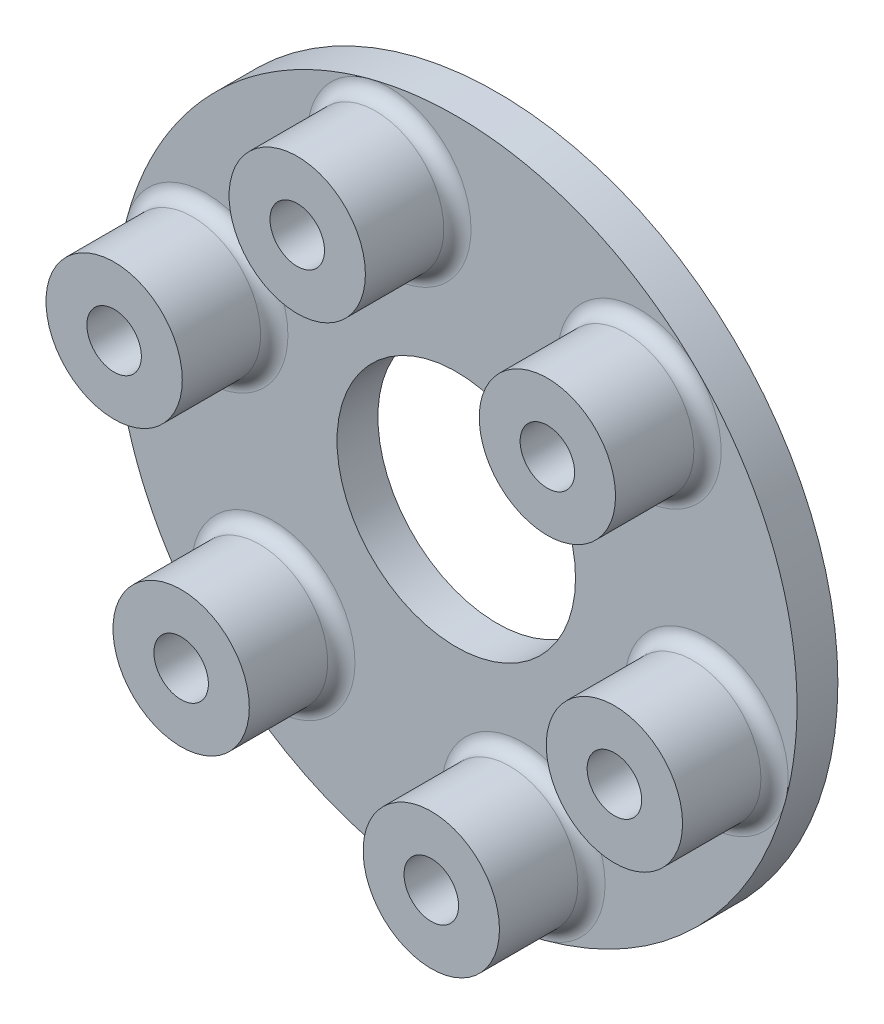
ISO-10303-21;
HEADER;
FILE_DESCRIPTION(('STEP AP214'),'2;1');
FILE_NAME('part.step','',(''),(''),'','','');
FILE_SCHEMA(('AUTOMOTIVE_DESIGN { 1 0 10303 214 1 1 1 1 }'));
ENDSEC;
DATA;
#1=APPLICATION_CONTEXT('core data for automotive mechanical design processes');
#2=APPLICATION_PROTOCOL_DEFINITION('international standard','automotive_design',2000,#1);
#3=PRODUCT_CONTEXT('',#1,'mechanical');
#4=PRODUCT('Part','Part','',(#3));
#5=PRODUCT_RELATED_PRODUCT_CATEGORY('part','',(#4));
#6=PRODUCT_DEFINITION_FORMATION('','',#4);
#7=PRODUCT_DEFINITION_CONTEXT('part definition',#1,'design');
#8=PRODUCT_DEFINITION('design','',#6,#7);
#9=PRODUCT_DEFINITION_SHAPE('','',#8);
#10=(LENGTH_UNIT() NAMED_UNIT(*) SI_UNIT(.MILLI.,.METRE.));
#11=(NAMED_UNIT(*) PLANE_ANGLE_UNIT() SI_UNIT($,.RADIAN.));
#12=(NAMED_UNIT(*) SI_UNIT($,.STERADIAN.) SOLID_ANGLE_UNIT());
#13=UNCERTAINTY_MEASURE_WITH_UNIT(LENGTH_MEASURE(1.E-05),#10,'distance_accuracy_value','');
#14=(GEOMETRIC_REPRESENTATION_CONTEXT(3) GLOBAL_UNCERTAINTY_ASSIGNED_CONTEXT((#13)) GLOBAL_UNIT_ASSIGNED_CONTEXT((#10,
#11,#12)) REPRESENTATION_CONTEXT('',''));
#15=CARTESIAN_POINT('',(0.,0.,0.));
#16=DIRECTION('',(0.,0.,1.));
#17=DIRECTION('',(1.,0.,0.));
#18=AXIS2_PLACEMENT_3D('',#15,#16,#17);
#19=CARTESIAN_POINT('',(4.91756185694798,-18.3525906994923,4.));
#20=DIRECTION('',(0.,0.,1.));
#21=DIRECTION('',(1.,0.,0.));
#22=AXIS2_PLACEMENT_3D('',#19,#20,#21);
#23=TOROIDAL_SURFACE('',#22,6.,1.);
#24=CARTESIAN_POINT('',(4.91756185694798,-18.3525906994923,4.));
#25=DIRECTION('',(0.,0.,1.));
#26=DIRECTION('',(1.,0.,0.));
#27=AXIS2_PLACEMENT_3D('',#24,#25,#26);
#28=CIRCLE('',#27,5.);
#29=CARTESIAN_POINT('',(9.91756185694798,-18.3525906994923,4.));
#30=VERTEX_POINT('',#29);
#31=EDGE_CURVE('E39',#30,#30,#28,.T.);
#32=ORIENTED_EDGE('',*,*,#31,.F.);
#33=EDGE_LOOP('',(#32));
#34=FACE_BOUND('',#33,.T.);
#35=CARTESIAN_POINT('',(4.91756185694798,-18.3525906994923,3.));
#36=DIRECTION('',(0.,0.,1.));
#37=DIRECTION('',(1.,0.,0.));
#38=AXIS2_PLACEMENT_3D('',#35,#36,#37);
#39=CIRCLE('',#38,6.);
#40=CARTESIAN_POINT('',(6.47047612756313,-24.1481456572267,3.));
#41=VERTEX_POINT('',#40);
#42=EDGE_CURVE('E11',#41,#41,#39,.F.);
#43=ORIENTED_EDGE('',*,*,#42,.F.);
#44=EDGE_LOOP('',(#43));
#45=FACE_BOUND('',#44,.T.);
#46=ADVANCED_FACE('F32',(#34,#45),#23,.F.);
#47=CARTESIAN_POINT('',(18.3525906994923,-4.91756185694791,4.));
#48=DIRECTION('',(0.,0.,1.));
#49=DIRECTION('',(1.,0.,0.));
#50=AXIS2_PLACEMENT_3D('',#47,#48,#49);
#51=TOROIDAL_SURFACE('',#50,6.,1.);
#52=CARTESIAN_POINT('',(18.3525906994923,-4.91756185694791,4.));
#53=DIRECTION('',(0.,0.,1.));
#54=DIRECTION('',(1.,0.,0.));
#55=AXIS2_PLACEMENT_3D('',#52,#53,#54);
#56=CIRCLE('',#55,5.);
#57=CARTESIAN_POINT('',(23.3525906994923,-4.91756185694791,4.));
#58=VERTEX_POINT('',#57);
#59=EDGE_CURVE('E173',#58,#58,#56,.T.);
#60=ORIENTED_EDGE('',*,*,#59,.F.);
#61=EDGE_LOOP('',(#60));
#62=FACE_BOUND('',#61,.T.);
#63=CARTESIAN_POINT('',(18.3525906994923,-4.91756185694791,3.));
#64=DIRECTION('',(0.,0.,1.));
#65=DIRECTION('',(1.,0.,0.));
#66=AXIS2_PLACEMENT_3D('',#63,#64,#65);
#67=CIRCLE('',#66,6.);
#68=CARTESIAN_POINT('',(24.1481456572267,-6.47047612756304,3.));
#69=VERTEX_POINT('',#68);
#70=EDGE_CURVE('E176',#69,#69,#67,.F.);
#71=ORIENTED_EDGE('',*,*,#70,.F.);
#72=EDGE_LOOP('',(#71));
#73=FACE_BOUND('',#72,.T.);
#74=ADVANCED_FACE('F185',(#62,#73),#51,.F.);
#75=CARTESIAN_POINT('',(13.4350288425444,13.4350288425444,4.));
#76=DIRECTION('',(0.,0.,1.));
#77=DIRECTION('',(1.,0.,0.));
#78=AXIS2_PLACEMENT_3D('',#75,#76,#77);
#79=TOROIDAL_SURFACE('',#78,6.,1.);
#80=CARTESIAN_POINT('',(13.4350288425444,13.4350288425444,4.));
#81=DIRECTION('',(0.,0.,1.));
#82=DIRECTION('',(1.,0.,0.));
#83=AXIS2_PLACEMENT_3D('',#80,#81,#82);
#84=CIRCLE('',#83,5.);
#85=CARTESIAN_POINT('',(18.4350288425444,13.4350288425444,4.));
#86=VERTEX_POINT('',#85);
#87=EDGE_CURVE('E169',#86,#86,#84,.T.);
#88=ORIENTED_EDGE('',*,*,#87,.F.);
#89=EDGE_LOOP('',(#88));
#90=FACE_BOUND('',#89,.T.);
#91=CARTESIAN_POINT('',(13.4350288425444,13.4350288425444,3.));
#92=DIRECTION('',(0.,0.,1.));
#93=DIRECTION('',(1.,0.,0.));
#94=AXIS2_PLACEMENT_3D('',#91,#92,#93);
#95=CIRCLE('',#94,6.);
#96=CARTESIAN_POINT('',(17.6776695296637,17.6776695296637,3.));
#97=VERTEX_POINT('',#96);
#98=EDGE_CURVE('E93',#97,#97,#95,.F.);
#99=ORIENTED_EDGE('',*,*,#98,.F.);
#100=EDGE_LOOP('',(#99));
#101=FACE_BOUND('',#100,.T.);
#102=ADVANCED_FACE('F189',(#90,#101),#79,.F.);
#103=CARTESIAN_POINT('',(-4.91756185694797,18.3525906994923,4.));
#104=DIRECTION('',(0.,0.,1.));
#105=DIRECTION('',(1.,0.,0.));
#106=AXIS2_PLACEMENT_3D('',#103,#104,#105);
#107=TOROIDAL_SURFACE('',#106,6.,1.);
#108=CARTESIAN_POINT('',(-4.91756185694797,18.3525906994923,4.));
#109=DIRECTION('',(0.,0.,1.));
#110=DIRECTION('',(1.,0.,0.));
#111=AXIS2_PLACEMENT_3D('',#108,#109,#110);
#112=CIRCLE('',#111,5.);
#113=CARTESIAN_POINT('',(0.0824381430520266,18.3525906994923,4.));
#114=VERTEX_POINT('',#113);
#115=EDGE_CURVE('E165',#114,#114,#112,.T.);
#116=ORIENTED_EDGE('',*,*,#115,.F.);
#117=EDGE_LOOP('',(#116));
#118=FACE_BOUND('',#117,.T.);
#119=CARTESIAN_POINT('',(-4.91756185694797,18.3525906994923,3.));
#120=DIRECTION('',(0.,0.,1.));
#121=DIRECTION('',(1.,0.,0.));
#122=AXIS2_PLACEMENT_3D('',#119,#120,#121);
#123=CIRCLE('',#122,6.);
#124=CARTESIAN_POINT('',(-6.47047612756313,24.1481456572267,3.));
#125=VERTEX_POINT('',#124);
#126=EDGE_CURVE('E91',#125,#125,#123,.F.);
#127=ORIENTED_EDGE('',*,*,#126,.F.);
#128=EDGE_LOOP('',(#127));
#129=FACE_BOUND('',#128,.T.);
#130=ADVANCED_FACE('F194',(#118,#129),#107,.F.);
#131=CARTESIAN_POINT('',(-18.3525906994923,4.91756185694781,4.));
#132=DIRECTION('',(0.,0.,1.));
#133=DIRECTION('',(1.,0.,0.));
#134=AXIS2_PLACEMENT_3D('',#131,#132,#133);
#135=TOROIDAL_SURFACE('',#134,6.,1.);
#136=CARTESIAN_POINT('',(-18.3525906994923,4.91756185694781,4.));
#137=DIRECTION('',(0.,0.,1.));
#138=DIRECTION('',(1.,0.,0.));
#139=AXIS2_PLACEMENT_3D('',#136,#137,#138);
#140=CIRCLE('',#139,5.);
#141=CARTESIAN_POINT('',(-13.3525906994923,4.91756185694781,4.));
#142=VERTEX_POINT('',#141);
#143=EDGE_CURVE('E161',#142,#142,#140,.T.);
#144=ORIENTED_EDGE('',*,*,#143,.F.);
#145=EDGE_LOOP('',(#144));
#146=FACE_BOUND('',#145,.T.);
#147=CARTESIAN_POINT('',(-18.3525906994923,4.91756185694781,3.));
#148=DIRECTION('',(0.,0.,1.));
#149=DIRECTION('',(1.,0.,0.));
#150=AXIS2_PLACEMENT_3D('',#147,#148,#149);
#151=CIRCLE('',#150,6.);
#152=CARTESIAN_POINT('',(-24.1481456572267,6.47047612756291,3.));
#153=VERTEX_POINT('',#152);
#154=EDGE_CURVE('E69',#153,#153,#151,.F.);
#155=ORIENTED_EDGE('',*,*,#154,.F.);
#156=EDGE_LOOP('',(#155));
#157=FACE_BOUND('',#156,.T.);
#158=ADVANCED_FACE('F202',(#146,#157),#135,.F.);
#159=CARTESIAN_POINT('',(-13.4350288425443,-13.4350288425445,4.));
#160=DIRECTION('',(0.,0.,1.));
#161=DIRECTION('',(1.,0.,0.));
#162=AXIS2_PLACEMENT_3D('',#159,#160,#161);
#163=TOROIDAL_SURFACE('',#162,6.,1.);
#164=CARTESIAN_POINT('',(-13.4350288425443,-13.4350288425445,4.));
#165=DIRECTION('',(0.,0.,1.));
#166=DIRECTION('',(1.,0.,0.));
#167=AXIS2_PLACEMENT_3D('',#164,#165,#166);
#168=CIRCLE('',#167,5.);
#169=CARTESIAN_POINT('',(-8.43502884254434,-13.4350288425445,4.));
#170=VERTEX_POINT('',#169);
#171=EDGE_CURVE('E82',#170,#170,#168,.T.);
#172=ORIENTED_EDGE('',*,*,#171,.F.);
#173=EDGE_LOOP('',(#172));
#174=FACE_BOUND('',#173,.T.);
#175=CARTESIAN_POINT('',(-13.4350288425443,-13.4350288425445,3.));
#176=DIRECTION('',(0.,0.,1.));
#177=DIRECTION('',(1.,0.,0.));
#178=AXIS2_PLACEMENT_3D('',#175,#176,#177);
#179=CIRCLE('',#178,6.);
#180=CARTESIAN_POINT('',(-17.6776695296636,-17.6776695296638,3.));
#181=VERTEX_POINT('',#180);
#182=EDGE_CURVE('E67',#181,#181,#179,.F.);
#183=ORIENTED_EDGE('',*,*,#182,.F.);
#184=EDGE_LOOP('',(#183));
#185=FACE_BOUND('',#184,.T.);
#186=ADVANCED_FACE('F206',(#174,#185),#163,.F.);
#187=CARTESIAN_POINT('',(0.,0.,3.));
#188=DIRECTION('',(0.,0.,1.));
#189=DIRECTION('',(1.,0.,0.));
#190=AXIS2_PLACEMENT_3D('',#187,#188,#189);
#191=PLANE('',#190);
#192=CARTESIAN_POINT('',(0.,0.,3.));
#193=DIRECTION('',(0.,0.,1.));
#194=DIRECTION('',(1.,0.,0.));
#195=AXIS2_PLACEMENT_3D('',#192,#193,#194);
#196=CIRCLE('',#195,25.);
#197=EDGE_CURVE('E76',#181,#41,#196,.T.);
#198=ORIENTED_EDGE('',*,*,#197,.T.);
#199=ORIENTED_EDGE('',*,*,#42,.T.);
#200=EDGE_CURVE('E48',#41,#69,#196,.T.);
#201=ORIENTED_EDGE('',*,*,#200,.T.);
#202=ORIENTED_EDGE('',*,*,#70,.T.);
#203=EDGE_CURVE('E85',#69,#97,#196,.T.);
#204=ORIENTED_EDGE('',*,*,#203,.T.);
#205=ORIENTED_EDGE('',*,*,#98,.T.);
#206=EDGE_CURVE('E77',#97,#125,#196,.T.);
#207=ORIENTED_EDGE('',*,*,#206,.T.);
#208=ORIENTED_EDGE('',*,*,#126,.T.);
#209=EDGE_CURVE('E73',#125,#153,#196,.T.);
#210=ORIENTED_EDGE('',*,*,#209,.T.);
#211=ORIENTED_EDGE('',*,*,#154,.T.);
#212=EDGE_CURVE('E63',#153,#181,#196,.T.);
#213=ORIENTED_EDGE('',*,*,#212,.T.);
#214=ORIENTED_EDGE('',*,*,#182,.T.);
#215=EDGE_LOOP('',(#198,#199,#201,#202,#204,#205,#207,#208,#210,#211,#213,#214));
#216=FACE_BOUND('',#215,.T.);
#217=CARTESIAN_POINT('',(0.,0.,3.));
#218=DIRECTION('',(0.,0.,1.));
#219=DIRECTION('',(1.,0.,0.));
#220=AXIS2_PLACEMENT_3D('',#217,#218,#219);
#221=CIRCLE('',#220,8.75);
#222=CARTESIAN_POINT('',(8.75,0.,3.));
#223=VERTEX_POINT('',#222);
#224=EDGE_CURVE('E79',#223,#223,#221,.T.);
#225=ORIENTED_EDGE('',*,*,#224,.F.);
#226=EDGE_LOOP('',(#225));
#227=FACE_BOUND('',#226,.T.);
#228=ADVANCED_FACE('F64',(#216,#227),#191,.T.);
#229=CARTESIAN_POINT('',(0.,0.,0.));
#230=DIRECTION('',(0.,0.,1.));
#231=DIRECTION('',(1.,0.,0.));
#232=AXIS2_PLACEMENT_3D('',#229,#230,#231);
#233=PLANE('',#232);
#234=CARTESIAN_POINT('',(-18.3525906994923,4.91756185694781,0.));
#235=DIRECTION('',(0.,0.,1.));
#236=DIRECTION('',(1.,0.,0.));
#237=AXIS2_PLACEMENT_3D('',#234,#235,#236);
#238=CIRCLE('',#237,2.);
#239=CARTESIAN_POINT('',(-16.3525906994923,4.91756185694781,0.));
#240=VERTEX_POINT('',#239);
#241=EDGE_CURVE('E148',#240,#240,#238,.T.);
#242=ORIENTED_EDGE('',*,*,#241,.T.);
#243=EDGE_LOOP('',(#242));
#244=FACE_BOUND('',#243,.T.);
#245=CARTESIAN_POINT('',(-13.4350288425443,-13.4350288425445,0.));
#246=DIRECTION('',(0.,0.,1.));
#247=DIRECTION('',(1.,0.,0.));
#248=AXIS2_PLACEMENT_3D('',#245,#246,#247);
#249=CIRCLE('',#248,2.);
#250=CARTESIAN_POINT('',(-11.4350288425443,-13.4350288425445,0.));
#251=VERTEX_POINT('',#250);
#252=EDGE_CURVE('E152',#251,#251,#249,.T.);
#253=ORIENTED_EDGE('',*,*,#252,.T.);
#254=EDGE_LOOP('',(#253));
#255=FACE_BOUND('',#254,.T.);
#256=CARTESIAN_POINT('',(4.91756185694798,-18.3525906994923,0.));
#257=DIRECTION('',(0.,0.,1.));
#258=DIRECTION('',(1.,0.,0.));
#259=AXIS2_PLACEMENT_3D('',#256,#257,#258);
#260=CIRCLE('',#259,2.);
#261=CARTESIAN_POINT('',(6.91756185694798,-18.3525906994923,0.));
#262=VERTEX_POINT('',#261);
#263=EDGE_CURVE('E156',#262,#262,#260,.T.);
#264=ORIENTED_EDGE('',*,*,#263,.T.);
#265=EDGE_LOOP('',(#264));
#266=FACE_BOUND('',#265,.T.);
#267=CARTESIAN_POINT('',(18.3525906994923,-4.91756185694791,0.));
#268=DIRECTION('',(0.,0.,1.));
#269=DIRECTION('',(1.,0.,0.));
#270=AXIS2_PLACEMENT_3D('',#267,#268,#269);
#271=CIRCLE('',#270,2.);
#272=CARTESIAN_POINT('',(20.3525906994923,-4.91756185694791,0.));
#273=VERTEX_POINT('',#272);
#274=EDGE_CURVE('E291',#273,#273,#271,.T.);
#275=ORIENTED_EDGE('',*,*,#274,.T.);
#276=EDGE_LOOP('',(#275));
#277=FACE_BOUND('',#276,.T.);
#278=CARTESIAN_POINT('',(13.4350288425444,13.4350288425444,0.));
#279=DIRECTION('',(0.,0.,1.));
#280=DIRECTION('',(1.,0.,0.));
#281=AXIS2_PLACEMENT_3D('',#278,#279,#280);
#282=CIRCLE('',#281,2.);
#283=CARTESIAN_POINT('',(15.4350288425444,13.4350288425444,0.));
#284=VERTEX_POINT('',#283);
#285=EDGE_CURVE('E289',#284,#284,#282,.T.);
#286=ORIENTED_EDGE('',*,*,#285,.T.);
#287=EDGE_LOOP('',(#286));
#288=FACE_BOUND('',#287,.T.);
#289=CARTESIAN_POINT('',(-4.91756185694797,18.3525906994923,0.));
#290=DIRECTION('',(0.,0.,1.));
#291=DIRECTION('',(1.,0.,0.));
#292=AXIS2_PLACEMENT_3D('',#289,#290,#291);
#293=CIRCLE('',#292,2.);
#294=CARTESIAN_POINT('',(-2.91756185694797,18.3525906994923,0.));
#295=VERTEX_POINT('',#294);
#296=EDGE_CURVE('E292',#295,#295,#293,.T.);
#297=ORIENTED_EDGE('',*,*,#296,.T.);
#298=EDGE_LOOP('',(#297));
#299=FACE_BOUND('',#298,.T.);
#300=CARTESIAN_POINT('',(0.,0.,0.));
#301=DIRECTION('',(0.,0.,1.));
#302=DIRECTION('',(1.,0.,0.));
#303=AXIS2_PLACEMENT_3D('',#300,#301,#302);
#304=CIRCLE('',#303,25.);
#305=CARTESIAN_POINT('',(25.,0.,0.));
#306=VERTEX_POINT('',#305);
#307=EDGE_CURVE('E74',#306,#306,#304,.T.);
#308=ORIENTED_EDGE('',*,*,#307,.F.);
#309=EDGE_LOOP('',(#308));
#310=FACE_BOUND('',#309,.T.);
#311=CARTESIAN_POINT('',(0.,0.,0.));
#312=DIRECTION('',(0.,0.,1.));
#313=DIRECTION('',(1.,0.,0.));
#314=AXIS2_PLACEMENT_3D('',#311,#312,#313);
#315=CIRCLE('',#314,8.75);
#316=CARTESIAN_POINT('',(8.75,0.,0.));
#317=VERTEX_POINT('',#316);
#318=EDGE_CURVE('E108',#317,#317,#315,.T.);
#319=ORIENTED_EDGE('',*,*,#318,.T.);
#320=EDGE_LOOP('',(#319));
#321=FACE_BOUND('',#320,.T.);
#322=ADVANCED_FACE('F98',(#244,#255,#266,#277,#288,#299,#310,#321),#233,.F.);
#323=CARTESIAN_POINT('',(0.,0.,3.));
#324=DIRECTION('',(0.,0.,-1.));
#325=DIRECTION('',(-1.,0.,0.));
#326=AXIS2_PLACEMENT_3D('',#323,#324,#325);
#327=CYLINDRICAL_SURFACE('',#326,25.);
#328=ORIENTED_EDGE('',*,*,#197,.F.);
#329=ORIENTED_EDGE('',*,*,#212,.F.);
#330=ORIENTED_EDGE('',*,*,#209,.F.);
#331=ORIENTED_EDGE('',*,*,#206,.F.);
#332=ORIENTED_EDGE('',*,*,#203,.F.);
#333=ORIENTED_EDGE('',*,*,#200,.F.);
#334=EDGE_LOOP('',(#328,#329,#330,#331,#332,#333));
#335=FACE_BOUND('',#334,.T.);
#336=ORIENTED_EDGE('',*,*,#307,.T.);
#337=EDGE_LOOP('',(#336));
#338=FACE_BOUND('',#337,.T.);
#339=ADVANCED_FACE('F94',(#335,#338),#327,.T.);
#340=CARTESIAN_POINT('',(0.,0.,3.));
#341=DIRECTION('',(0.,0.,-1.));
#342=DIRECTION('',(-1.,0.,0.));
#343=AXIS2_PLACEMENT_3D('',#340,#341,#342);
#344=CYLINDRICAL_SURFACE('',#343,8.75);
#345=ORIENTED_EDGE('',*,*,#224,.T.);
#346=EDGE_LOOP('',(#345));
#347=FACE_BOUND('',#346,.T.);
#348=ORIENTED_EDGE('',*,*,#318,.F.);
#349=EDGE_LOOP('',(#348));
#350=FACE_BOUND('',#349,.T.);
#351=ADVANCED_FACE('F97',(#347,#350),#344,.F.);
#352=CARTESIAN_POINT('',(-4.91756185694797,18.3525906994923,9.75));
#353=DIRECTION('',(0.,0.,1.));
#354=DIRECTION('',(1.,0.,0.));
#355=AXIS2_PLACEMENT_3D('',#352,#353,#354);
#356=PLANE('',#355);
#357=CARTESIAN_POINT('',(-4.91756185694797,18.3525906994923,9.75));
#358=DIRECTION('',(0.,0.,1.));
#359=DIRECTION('',(1.,0.,0.));
#360=AXIS2_PLACEMENT_3D('',#357,#358,#359);
#361=CIRCLE('',#360,5.);
#362=CARTESIAN_POINT('',(0.0824381430520266,18.3525906994923,9.75));
#363=VERTEX_POINT('',#362);
#364=EDGE_CURVE('E110',#363,#363,#361,.T.);
#365=ORIENTED_EDGE('',*,*,#364,.T.);
#366=EDGE_LOOP('',(#365));
#367=FACE_BOUND('',#366,.T.);
#368=CARTESIAN_POINT('',(-4.91756185694797,18.3525906994923,9.75));
#369=DIRECTION('',(0.,0.,1.));
#370=DIRECTION('',(1.,0.,0.));
#371=AXIS2_PLACEMENT_3D('',#368,#369,#370);
#372=CIRCLE('',#371,2.);
#373=CARTESIAN_POINT('',(-2.91756185694797,18.3525906994923,9.75));
#374=VERTEX_POINT('',#373);
#375=EDGE_CURVE('E114',#374,#374,#372,.T.);
#376=ORIENTED_EDGE('',*,*,#375,.F.);
#377=EDGE_LOOP('',(#376));
#378=FACE_BOUND('',#377,.T.);
#379=ADVANCED_FACE('F215',(#367,#378),#356,.T.);
#380=CARTESIAN_POINT('',(-4.91756185694797,18.3525906994923,9.75));
#381=DIRECTION('',(0.,0.,-1.));
#382=DIRECTION('',(-1.,0.,0.));
#383=AXIS2_PLACEMENT_3D('',#380,#381,#382);
#384=CYLINDRICAL_SURFACE('',#383,5.);
#385=ORIENTED_EDGE('',*,*,#115,.T.);
#386=EDGE_LOOP('',(#385));
#387=FACE_BOUND('',#386,.T.);
#388=ORIENTED_EDGE('',*,*,#364,.F.);
#389=EDGE_LOOP('',(#388));
#390=FACE_BOUND('',#389,.T.);
#391=ADVANCED_FACE('F217',(#387,#390),#384,.T.);
#392=CARTESIAN_POINT('',(-4.91756185694797,18.3525906994923,9.75));
#393=DIRECTION('',(0.,0.,-1.));
#394=DIRECTION('',(-1.,0.,0.));
#395=AXIS2_PLACEMENT_3D('',#392,#393,#394);
#396=CYLINDRICAL_SURFACE('',#395,2.);
#397=ORIENTED_EDGE('',*,*,#375,.T.);
#398=EDGE_LOOP('',(#397));
#399=FACE_BOUND('',#398,.T.);
#400=ORIENTED_EDGE('',*,*,#296,.F.);
#401=EDGE_LOOP('',(#400));
#402=FACE_BOUND('',#401,.T.);
#403=ADVANCED_FACE('F220',(#399,#402),#396,.F.);
#404=CARTESIAN_POINT('',(-18.3525906994923,4.91756185694781,9.75));
#405=DIRECTION('',(0.,0.,1.));
#406=DIRECTION('',(1.,0.,0.));
#407=AXIS2_PLACEMENT_3D('',#404,#405,#406);
#408=PLANE('',#407);
#409=CARTESIAN_POINT('',(-18.3525906994923,4.91756185694781,9.75));
#410=DIRECTION('',(0.,0.,1.));
#411=DIRECTION('',(1.,0.,0.));
#412=AXIS2_PLACEMENT_3D('',#409,#410,#411);
#413=CIRCLE('',#412,5.);
#414=CARTESIAN_POINT('',(-13.3525906994923,4.91756185694781,9.75));
#415=VERTEX_POINT('',#414);
#416=EDGE_CURVE('E119',#415,#415,#413,.T.);
#417=ORIENTED_EDGE('',*,*,#416,.T.);
#418=EDGE_LOOP('',(#417));
#419=FACE_BOUND('',#418,.T.);
#420=CARTESIAN_POINT('',(-18.3525906994923,4.91756185694781,9.75));
#421=DIRECTION('',(0.,0.,1.));
#422=DIRECTION('',(1.,0.,0.));
#423=AXIS2_PLACEMENT_3D('',#420,#421,#422);
#424=CIRCLE('',#423,2.);
#425=CARTESIAN_POINT('',(-16.3525906994923,4.91756185694781,9.75));
#426=VERTEX_POINT('',#425);
#427=EDGE_CURVE('E122',#426,#426,#424,.T.);
#428=ORIENTED_EDGE('',*,*,#427,.F.);
#429=EDGE_LOOP('',(#428));
#430=FACE_BOUND('',#429,.T.);
#431=ADVANCED_FACE('F227',(#419,#430),#408,.T.);
#432=CARTESIAN_POINT('',(-18.3525906994923,4.91756185694781,9.75));
#433=DIRECTION('',(0.,0.,-1.));
#434=DIRECTION('',(-1.,0.,0.));
#435=AXIS2_PLACEMENT_3D('',#432,#433,#434);
#436=CYLINDRICAL_SURFACE('',#435,5.);
#437=ORIENTED_EDGE('',*,*,#143,.T.);
#438=EDGE_LOOP('',(#437));
#439=FACE_BOUND('',#438,.T.);
#440=ORIENTED_EDGE('',*,*,#416,.F.);
#441=EDGE_LOOP('',(#440));
#442=FACE_BOUND('',#441,.T.);
#443=ADVANCED_FACE('F229',(#439,#442),#436,.T.);
#444=CARTESIAN_POINT('',(-18.3525906994923,4.91756185694781,9.75));
#445=DIRECTION('',(0.,0.,-1.));
#446=DIRECTION('',(-1.,0.,0.));
#447=AXIS2_PLACEMENT_3D('',#444,#445,#446);
#448=CYLINDRICAL_SURFACE('',#447,2.);
#449=ORIENTED_EDGE('',*,*,#427,.T.);
#450=EDGE_LOOP('',(#449));
#451=FACE_BOUND('',#450,.T.);
#452=ORIENTED_EDGE('',*,*,#241,.F.);
#453=EDGE_LOOP('',(#452));
#454=FACE_BOUND('',#453,.T.);
#455=ADVANCED_FACE('F232',(#451,#454),#448,.F.);
#456=CARTESIAN_POINT('',(-13.4350288425443,-13.4350288425445,9.75));
#457=DIRECTION('',(0.,0.,1.));
#458=DIRECTION('',(1.,0.,0.));
#459=AXIS2_PLACEMENT_3D('',#456,#457,#458);
#460=PLANE('',#459);
#461=CARTESIAN_POINT('',(-13.4350288425443,-13.4350288425445,9.75));
#462=DIRECTION('',(0.,0.,1.));
#463=DIRECTION('',(1.,0.,0.));
#464=AXIS2_PLACEMENT_3D('',#461,#462,#463);
#465=CIRCLE('',#464,5.);
#466=CARTESIAN_POINT('',(-8.43502884254434,-13.4350288425445,9.75));
#467=VERTEX_POINT('',#466);
#468=EDGE_CURVE('E125',#467,#467,#465,.T.);
#469=ORIENTED_EDGE('',*,*,#468,.T.);
#470=EDGE_LOOP('',(#469));
#471=FACE_BOUND('',#470,.T.);
#472=CARTESIAN_POINT('',(-13.4350288425443,-13.4350288425445,9.75));
#473=DIRECTION('',(0.,0.,1.));
#474=DIRECTION('',(1.,0.,0.));
#475=AXIS2_PLACEMENT_3D('',#472,#473,#474);
#476=CIRCLE('',#475,2.);
#477=CARTESIAN_POINT('',(-11.4350288425443,-13.4350288425445,9.75));
#478=VERTEX_POINT('',#477);
#479=EDGE_CURVE('E128',#478,#478,#476,.T.);
#480=ORIENTED_EDGE('',*,*,#479,.F.);
#481=EDGE_LOOP('',(#480));
#482=FACE_BOUND('',#481,.T.);
#483=ADVANCED_FACE('F239',(#471,#482),#460,.T.);
#484=CARTESIAN_POINT('',(-13.4350288425443,-13.4350288425445,9.75));
#485=DIRECTION('',(0.,0.,-1.));
#486=DIRECTION('',(-1.,0.,0.));
#487=AXIS2_PLACEMENT_3D('',#484,#485,#486);
#488=CYLINDRICAL_SURFACE('',#487,5.);
#489=ORIENTED_EDGE('',*,*,#171,.T.);
#490=EDGE_LOOP('',(#489));
#491=FACE_BOUND('',#490,.T.);
#492=ORIENTED_EDGE('',*,*,#468,.F.);
#493=EDGE_LOOP('',(#492));
#494=FACE_BOUND('',#493,.T.);
#495=ADVANCED_FACE('F241',(#491,#494),#488,.T.);
#496=CARTESIAN_POINT('',(-13.4350288425443,-13.4350288425445,9.75));
#497=DIRECTION('',(0.,0.,-1.));
#498=DIRECTION('',(-1.,0.,0.));
#499=AXIS2_PLACEMENT_3D('',#496,#497,#498);
#500=CYLINDRICAL_SURFACE('',#499,2.);
#501=ORIENTED_EDGE('',*,*,#479,.T.);
#502=EDGE_LOOP('',(#501));
#503=FACE_BOUND('',#502,.T.);
#504=ORIENTED_EDGE('',*,*,#252,.F.);
#505=EDGE_LOOP('',(#504));
#506=FACE_BOUND('',#505,.T.);
#507=ADVANCED_FACE('F244',(#503,#506),#500,.F.);
#508=CARTESIAN_POINT('',(4.91756185694798,-18.3525906994923,9.75));
#509=DIRECTION('',(0.,0.,1.));
#510=DIRECTION('',(1.,0.,0.));
#511=AXIS2_PLACEMENT_3D('',#508,#509,#510);
#512=PLANE('',#511);
#513=CARTESIAN_POINT('',(4.91756185694798,-18.3525906994923,9.75));
#514=DIRECTION('',(0.,0.,1.));
#515=DIRECTION('',(1.,0.,0.));
#516=AXIS2_PLACEMENT_3D('',#513,#514,#515);
#517=CIRCLE('',#516,5.);
#518=CARTESIAN_POINT('',(9.91756185694798,-18.3525906994923,9.75));
#519=VERTEX_POINT('',#518);
#520=EDGE_CURVE('E131',#519,#519,#517,.T.);
#521=ORIENTED_EDGE('',*,*,#520,.T.);
#522=EDGE_LOOP('',(#521));
#523=FACE_BOUND('',#522,.T.);
#524=CARTESIAN_POINT('',(4.91756185694798,-18.3525906994923,9.75));
#525=DIRECTION('',(0.,0.,1.));
#526=DIRECTION('',(1.,0.,0.));
#527=AXIS2_PLACEMENT_3D('',#524,#525,#526);
#528=CIRCLE('',#527,2.);
#529=CARTESIAN_POINT('',(6.91756185694798,-18.3525906994923,9.75));
#530=VERTEX_POINT('',#529);
#531=EDGE_CURVE('E134',#530,#530,#528,.T.);
#532=ORIENTED_EDGE('',*,*,#531,.F.);
#533=EDGE_LOOP('',(#532));
#534=FACE_BOUND('',#533,.T.);
#535=ADVANCED_FACE('F251',(#523,#534),#512,.T.);
#536=CARTESIAN_POINT('',(4.91756185694798,-18.3525906994923,9.75));
#537=DIRECTION('',(0.,0.,-1.));
#538=DIRECTION('',(-1.,0.,0.));
#539=AXIS2_PLACEMENT_3D('',#536,#537,#538);
#540=CYLINDRICAL_SURFACE('',#539,5.);
#541=ORIENTED_EDGE('',*,*,#31,.T.);
#542=EDGE_LOOP('',(#541));
#543=FACE_BOUND('',#542,.T.);
#544=ORIENTED_EDGE('',*,*,#520,.F.);
#545=EDGE_LOOP('',(#544));
#546=FACE_BOUND('',#545,.T.);
#547=ADVANCED_FACE('F180',(#543,#546),#540,.T.);
#548=CARTESIAN_POINT('',(4.91756185694798,-18.3525906994923,9.75));
#549=DIRECTION('',(0.,0.,-1.));
#550=DIRECTION('',(-1.,0.,0.));
#551=AXIS2_PLACEMENT_3D('',#548,#549,#550);
#552=CYLINDRICAL_SURFACE('',#551,2.);
#553=ORIENTED_EDGE('',*,*,#531,.T.);
#554=EDGE_LOOP('',(#553));
#555=FACE_BOUND('',#554,.T.);
#556=ORIENTED_EDGE('',*,*,#263,.F.);
#557=EDGE_LOOP('',(#556));
#558=FACE_BOUND('',#557,.T.);
#559=ADVANCED_FACE('F255',(#555,#558),#552,.F.);
#560=CARTESIAN_POINT('',(18.3525906994923,-4.91756185694791,9.75));
#561=DIRECTION('',(0.,0.,1.));
#562=DIRECTION('',(1.,0.,0.));
#563=AXIS2_PLACEMENT_3D('',#560,#561,#562);
#564=PLANE('',#563);
#565=CARTESIAN_POINT('',(18.3525906994923,-4.91756185694791,9.75));
#566=DIRECTION('',(0.,0.,1.));
#567=DIRECTION('',(1.,0.,0.));
#568=AXIS2_PLACEMENT_3D('',#565,#566,#567);
#569=CIRCLE('',#568,5.);
#570=CARTESIAN_POINT('',(23.3525906994923,-4.91756185694791,9.75));
#571=VERTEX_POINT('',#570);
#572=EDGE_CURVE('E137',#571,#571,#569,.T.);
#573=ORIENTED_EDGE('',*,*,#572,.T.);
#574=EDGE_LOOP('',(#573));
#575=FACE_BOUND('',#574,.T.);
#576=CARTESIAN_POINT('',(18.3525906994923,-4.91756185694791,9.75));
#577=DIRECTION('',(0.,0.,1.));
#578=DIRECTION('',(1.,0.,0.));
#579=AXIS2_PLACEMENT_3D('',#576,#577,#578);
#580=CIRCLE('',#579,2.);
#581=CARTESIAN_POINT('',(20.3525906994923,-4.91756185694791,9.75));
#582=VERTEX_POINT('',#581);
#583=EDGE_CURVE('E140',#582,#582,#580,.T.);
#584=ORIENTED_EDGE('',*,*,#583,.F.);
#585=EDGE_LOOP('',(#584));
#586=FACE_BOUND('',#585,.T.);
#587=ADVANCED_FACE('F261',(#575,#586),#564,.T.);
#588=CARTESIAN_POINT('',(18.3525906994923,-4.91756185694791,9.75));
#589=DIRECTION('',(0.,0.,-1.));
#590=DIRECTION('',(-1.,0.,0.));
#591=AXIS2_PLACEMENT_3D('',#588,#589,#590);
#592=CYLINDRICAL_SURFACE('',#591,5.);
#593=ORIENTED_EDGE('',*,*,#59,.T.);
#594=EDGE_LOOP('',(#593));
#595=FACE_BOUND('',#594,.T.);
#596=ORIENTED_EDGE('',*,*,#572,.F.);
#597=EDGE_LOOP('',(#596));
#598=FACE_BOUND('',#597,.T.);
#599=ADVANCED_FACE('F263',(#595,#598),#592,.T.);
#600=CARTESIAN_POINT('',(18.3525906994923,-4.91756185694791,9.75));
#601=DIRECTION('',(0.,0.,-1.));
#602=DIRECTION('',(-1.,0.,0.));
#603=AXIS2_PLACEMENT_3D('',#600,#601,#602);
#604=CYLINDRICAL_SURFACE('',#603,2.);
#605=ORIENTED_EDGE('',*,*,#583,.T.);
#606=EDGE_LOOP('',(#605));
#607=FACE_BOUND('',#606,.T.);
#608=ORIENTED_EDGE('',*,*,#274,.F.);
#609=EDGE_LOOP('',(#608));
#610=FACE_BOUND('',#609,.T.);
#611=ADVANCED_FACE('F266',(#607,#610),#604,.F.);
#612=CARTESIAN_POINT('',(13.4350288425444,13.4350288425444,9.75));
#613=DIRECTION('',(0.,0.,1.));
#614=DIRECTION('',(1.,0.,0.));
#615=AXIS2_PLACEMENT_3D('',#612,#613,#614);
#616=PLANE('',#615);
#617=CARTESIAN_POINT('',(13.4350288425444,13.4350288425444,9.75));
#618=DIRECTION('',(0.,0.,1.));
#619=DIRECTION('',(1.,0.,0.));
#620=AXIS2_PLACEMENT_3D('',#617,#618,#619);
#621=CIRCLE('',#620,5.);
#622=CARTESIAN_POINT('',(18.4350288425444,13.4350288425444,9.75));
#623=VERTEX_POINT('',#622);
#624=EDGE_CURVE('E143',#623,#623,#621,.T.);
#625=ORIENTED_EDGE('',*,*,#624,.T.);
#626=EDGE_LOOP('',(#625));
#627=FACE_BOUND('',#626,.T.);
#628=CARTESIAN_POINT('',(13.4350288425444,13.4350288425444,9.75));
#629=DIRECTION('',(0.,0.,1.));
#630=DIRECTION('',(1.,0.,0.));
#631=AXIS2_PLACEMENT_3D('',#628,#629,#630);
#632=CIRCLE('',#631,2.);
#633=CARTESIAN_POINT('',(15.4350288425444,13.4350288425444,9.75));
#634=VERTEX_POINT('',#633);
#635=EDGE_CURVE('E146',#634,#634,#632,.T.);
#636=ORIENTED_EDGE('',*,*,#635,.F.);
#637=EDGE_LOOP('',(#636));
#638=FACE_BOUND('',#637,.T.);
#639=ADVANCED_FACE('F273',(#627,#638),#616,.T.);
#640=CARTESIAN_POINT('',(13.4350288425444,13.4350288425444,9.75));
#641=DIRECTION('',(0.,0.,-1.));
#642=DIRECTION('',(-1.,0.,0.));
#643=AXIS2_PLACEMENT_3D('',#640,#641,#642);
#644=CYLINDRICAL_SURFACE('',#643,5.);
#645=ORIENTED_EDGE('',*,*,#87,.T.);
#646=EDGE_LOOP('',(#645));
#647=FACE_BOUND('',#646,.T.);
#648=ORIENTED_EDGE('',*,*,#624,.F.);
#649=EDGE_LOOP('',(#648));
#650=FACE_BOUND('',#649,.T.);
#651=ADVANCED_FACE('F275',(#647,#650),#644,.T.);
#652=CARTESIAN_POINT('',(13.4350288425444,13.4350288425444,9.75));
#653=DIRECTION('',(0.,0.,-1.));
#654=DIRECTION('',(-1.,0.,0.));
#655=AXIS2_PLACEMENT_3D('',#652,#653,#654);
#656=CYLINDRICAL_SURFACE('',#655,2.);
#657=ORIENTED_EDGE('',*,*,#635,.T.);
#658=EDGE_LOOP('',(#657));
#659=FACE_BOUND('',#658,.T.);
#660=ORIENTED_EDGE('',*,*,#285,.F.);
#661=EDGE_LOOP('',(#660));
#662=FACE_BOUND('',#661,.T.);
#663=ADVANCED_FACE('F278',(#659,#662),#656,.F.);
#664=CLOSED_SHELL('',(#46,#74,#102,#130,#158,#186,#228,#322,#339,#351,#379,#391,#403,#431,#443,
#455,#483,#495,#507,#535,#547,#559,#587,#599,#611,#639,#651,#663));
#665=MANIFOLD_SOLID_BREP('B2',#664);
#666=ADVANCED_BREP_SHAPE_REPRESENTATION('',(#18,#665),#14);
#667=SHAPE_DEFINITION_REPRESENTATION(#9,#666);
ENDSEC;
END-ISO-10303-21;
